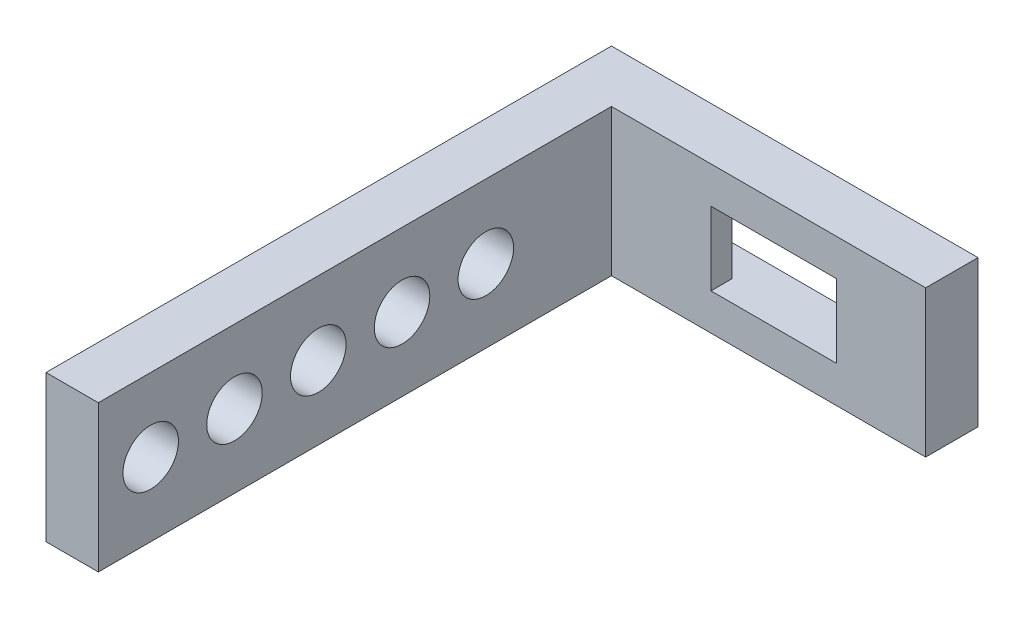
ISO-10303-21;
HEADER;
FILE_DESCRIPTION(('STEP AP214'),'2;1');
FILE_NAME('part.step','',(''),(''),'','','');
FILE_SCHEMA(('AUTOMOTIVE_DESIGN { 1 0 10303 214 1 1 1 1 }'));
ENDSEC;
DATA;
#1=APPLICATION_CONTEXT('core data for automotive mechanical design processes');
#2=APPLICATION_PROTOCOL_DEFINITION('international standard','automotive_design',2000,#1);
#3=PRODUCT_CONTEXT('',#1,'mechanical');
#4=PRODUCT('Part','Part','',(#3));
#5=PRODUCT_RELATED_PRODUCT_CATEGORY('part','',(#4));
#6=PRODUCT_DEFINITION_FORMATION('','',#4);
#7=PRODUCT_DEFINITION_CONTEXT('part definition',#1,'design');
#8=PRODUCT_DEFINITION('design','',#6,#7);
#9=PRODUCT_DEFINITION_SHAPE('','',#8);
#10=(LENGTH_UNIT() NAMED_UNIT(*) SI_UNIT(.MILLI.,.METRE.));
#11=(NAMED_UNIT(*) PLANE_ANGLE_UNIT() SI_UNIT($,.RADIAN.));
#12=(NAMED_UNIT(*) SI_UNIT($,.STERADIAN.) SOLID_ANGLE_UNIT());
#13=UNCERTAINTY_MEASURE_WITH_UNIT(LENGTH_MEASURE(1.E-05),#10,'distance_accuracy_value','');
#14=(GEOMETRIC_REPRESENTATION_CONTEXT(3) GLOBAL_UNCERTAINTY_ASSIGNED_CONTEXT((#13)) GLOBAL_UNIT_ASSIGNED_CONTEXT((#10,
#11,#12)) REPRESENTATION_CONTEXT('',''));
#15=CARTESIAN_POINT('',(0.,0.,0.));
#16=DIRECTION('',(0.,0.,1.));
#17=DIRECTION('',(1.,0.,0.));
#18=AXIS2_PLACEMENT_3D('',#15,#16,#17);
#19=CARTESIAN_POINT('',(0.,0.,-6.));
#20=DIRECTION('',(0.,0.,1.));
#21=DIRECTION('',(1.,0.,0.));
#22=AXIS2_PLACEMENT_3D('',#19,#20,#21);
#23=PLANE('',#22);
#24=DIRECTION('',(0.,-1.,0.));
#25=VECTOR('',#24,1.);
#26=CARTESIAN_POINT('',(26.5,10.5,-6.));
#27=LINE('',#26,#25);
#28=CARTESIAN_POINT('',(26.5,10.5,-6.));
#29=VERTEX_POINT('',#28);
#30=CARTESIAN_POINT('',(26.5,3.5,-6.));
#31=VERTEX_POINT('',#30);
#32=EDGE_CURVE('E308',#29,#31,#27,.T.);
#33=ORIENTED_EDGE('',*,*,#32,.F.);
#34=DIRECTION('',(1.,0.,0.));
#35=VECTOR('',#34,1.);
#36=CARTESIAN_POINT('',(8.,10.5,-6.));
#37=LINE('',#36,#35);
#38=CARTESIAN_POINT('',(33.,10.5,-6.));
#39=VERTEX_POINT('',#38);
#40=EDGE_CURVE('E287',#29,#39,#37,.T.);
#41=ORIENTED_EDGE('',*,*,#40,.T.);
#42=DIRECTION('',(0.,-1.,0.));
#43=VECTOR('',#42,1.);
#44=CARTESIAN_POINT('',(33.,10.5,-6.));
#45=LINE('',#44,#43);
#46=CARTESIAN_POINT('',(33.,3.5,-6.));
#47=VERTEX_POINT('',#46);
#48=EDGE_CURVE('E279',#39,#47,#45,.T.);
#49=ORIENTED_EDGE('',*,*,#48,.T.);
#50=DIRECTION('',(-1.,0.,0.));
#51=VECTOR('',#50,1.);
#52=CARTESIAN_POINT('',(8.,3.5,-6.));
#53=LINE('',#52,#51);
#54=EDGE_CURVE('E250',#47,#31,#53,.T.);
#55=ORIENTED_EDGE('',*,*,#54,.T.);
#56=EDGE_LOOP('',(#33,#41,#49,#55));
#57=FACE_BOUND('',#56,.T.);
#58=ADVANCED_FACE('F39',(#57),#23,.F.);
#59=DIRECTION('',(0.,1.,0.));
#60=VECTOR('',#59,1.);
#61=CARTESIAN_POINT('',(14.5,10.5,-6.));
#62=LINE('',#61,#60);
#63=CARTESIAN_POINT('',(14.5,3.5,-6.));
#64=VERTEX_POINT('',#63);
#65=CARTESIAN_POINT('',(14.5,10.5,-6.));
#66=VERTEX_POINT('',#65);
#67=EDGE_CURVE('E298',#64,#66,#62,.T.);
#68=ORIENTED_EDGE('',*,*,#67,.F.);
#69=CARTESIAN_POINT('',(8.,3.5,-6.));
#70=VERTEX_POINT('',#69);
#71=EDGE_CURVE('E278',#64,#70,#53,.T.);
#72=ORIENTED_EDGE('',*,*,#71,.T.);
#73=DIRECTION('',(0.,1.,0.));
#74=VECTOR('',#73,1.);
#75=CARTESIAN_POINT('',(8.,10.5,-6.));
#76=LINE('',#75,#74);
#77=CARTESIAN_POINT('',(8.,10.5,-6.));
#78=VERTEX_POINT('',#77);
#79=EDGE_CURVE('E262',#70,#78,#76,.T.);
#80=ORIENTED_EDGE('',*,*,#79,.T.);
#81=EDGE_CURVE('E283',#78,#66,#37,.T.);
#82=ORIENTED_EDGE('',*,*,#81,.T.);
#83=EDGE_LOOP('',(#68,#72,#80,#82));
#84=FACE_BOUND('',#83,.T.);
#85=ADVANCED_FACE('F331',(#84),#23,.F.);
#86=CARTESIAN_POINT('',(10.,14.,-4.));
#87=DIRECTION('',(0.,0.,-1.));
#88=DIRECTION('',(-1.,0.,0.));
#89=AXIS2_PLACEMENT_3D('',#86,#87,#88);
#90=PLANE('',#89);
#91=DIRECTION('',(-1.,0.,0.));
#92=VECTOR('',#91,1.);
#93=CARTESIAN_POINT('',(14.5,10.5,-4.));
#94=LINE('',#93,#92);
#95=CARTESIAN_POINT('',(26.5,10.5,-4.));
#96=VERTEX_POINT('',#95);
#97=CARTESIAN_POINT('',(14.5,10.5,-4.));
#98=VERTEX_POINT('',#97);
#99=EDGE_CURVE('E316',#96,#98,#94,.T.);
#100=ORIENTED_EDGE('',*,*,#99,.F.);
#101=DIRECTION('',(0.,1.,0.));
#102=VECTOR('',#101,1.);
#103=CARTESIAN_POINT('',(26.5,10.5,-4.));
#104=LINE('',#103,#102);
#105=CARTESIAN_POINT('',(26.5,3.5,-4.));
#106=VERTEX_POINT('',#105);
#107=EDGE_CURVE('E312',#106,#96,#104,.T.);
#108=ORIENTED_EDGE('',*,*,#107,.F.);
#109=DIRECTION('',(1.,0.,0.));
#110=VECTOR('',#109,1.);
#111=CARTESIAN_POINT('',(14.5,3.5,-4.));
#112=LINE('',#111,#110);
#113=CARTESIAN_POINT('',(14.5,3.5,-4.));
#114=VERTEX_POINT('',#113);
#115=EDGE_CURVE('E274',#114,#106,#112,.T.);
#116=ORIENTED_EDGE('',*,*,#115,.F.);
#117=DIRECTION('',(0.,-1.,0.));
#118=VECTOR('',#117,1.);
#119=CARTESIAN_POINT('',(14.5,10.5,-4.));
#120=LINE('',#119,#118);
#121=EDGE_CURVE('E320',#98,#114,#120,.T.);
#122=ORIENTED_EDGE('',*,*,#121,.F.);
#123=EDGE_LOOP('',(#100,#108,#116,#122));
#124=FACE_BOUND('',#123,.T.);
#125=DIRECTION('',(1.,0.,0.));
#126=VECTOR('',#125,1.);
#127=CARTESIAN_POINT('',(10.,0.,-4.));
#128=LINE('',#127,#126);
#129=CARTESIAN_POINT('',(5.,0.,-4.));
#130=VERTEX_POINT('',#129);
#131=CARTESIAN_POINT('',(35.,0.,-4.));
#132=VERTEX_POINT('',#131);
#133=EDGE_CURVE('E163',#130,#132,#128,.T.);
#134=ORIENTED_EDGE('',*,*,#133,.T.);
#135=DIRECTION('',(0.,-1.,0.));
#136=VECTOR('',#135,1.);
#137=CARTESIAN_POINT('',(35.,0.,-4.));
#138=LINE('',#137,#136);
#139=CARTESIAN_POINT('',(35.,14.,-3.99999999999998));
#140=VERTEX_POINT('',#139);
#141=EDGE_CURVE('E55',#140,#132,#138,.T.);
#142=ORIENTED_EDGE('',*,*,#141,.F.);
#143=DIRECTION('',(1.,0.,0.));
#144=VECTOR('',#143,1.);
#145=CARTESIAN_POINT('',(10.,14.,-4.));
#146=LINE('',#145,#144);
#147=CARTESIAN_POINT('',(5.,14.,-4.));
#148=VERTEX_POINT('',#147);
#149=EDGE_CURVE('E167',#148,#140,#146,.T.);
#150=ORIENTED_EDGE('',*,*,#149,.F.);
#151=DIRECTION('',(0.,1.,0.));
#152=VECTOR('',#151,1.);
#153=CARTESIAN_POINT('',(5.,0.,-4.));
#154=LINE('',#153,#152);
#155=EDGE_CURVE('E210',#130,#148,#154,.T.);
#156=ORIENTED_EDGE('',*,*,#155,.F.);
#157=EDGE_LOOP('',(#134,#142,#150,#156));
#158=FACE_BOUND('',#157,.T.);
#159=ADVANCED_FACE('F41',(#124,#158),#90,.F.);
#160=CARTESIAN_POINT('',(0.,14.,-9.));
#161=DIRECTION('',(0.,0.,1.));
#162=DIRECTION('',(1.,0.,0.));
#163=AXIS2_PLACEMENT_3D('',#160,#161,#162);
#164=PLANE('',#163);
#165=DIRECTION('',(1.,0.,0.));
#166=VECTOR('',#165,1.);
#167=CARTESIAN_POINT('',(8.,10.5,-9.));
#168=LINE('',#167,#166);
#169=CARTESIAN_POINT('',(8.,10.5,-9.));
#170=VERTEX_POINT('',#169);
#171=CARTESIAN_POINT('',(33.,10.5,-9.));
#172=VERTEX_POINT('',#171);
#173=EDGE_CURVE('E267',#170,#172,#168,.T.);
#174=ORIENTED_EDGE('',*,*,#173,.F.);
#175=DIRECTION('',(0.,1.,0.));
#176=VECTOR('',#175,1.);
#177=CARTESIAN_POINT('',(8.,10.5,-9.));
#178=LINE('',#177,#176);
#179=CARTESIAN_POINT('',(8.,3.5,-9.));
#180=VERTEX_POINT('',#179);
#181=EDGE_CURVE('E271',#180,#170,#178,.T.);
#182=ORIENTED_EDGE('',*,*,#181,.F.);
#183=DIRECTION('',(-1.,0.,0.));
#184=VECTOR('',#183,1.);
#185=CARTESIAN_POINT('',(8.,3.5,-9.));
#186=LINE('',#185,#184);
#187=CARTESIAN_POINT('',(33.,3.5,-9.));
#188=VERTEX_POINT('',#187);
#189=EDGE_CURVE('E258',#188,#180,#186,.T.);
#190=ORIENTED_EDGE('',*,*,#189,.F.);
#191=DIRECTION('',(0.,-1.,0.));
#192=VECTOR('',#191,1.);
#193=CARTESIAN_POINT('',(33.,10.5,-9.));
#194=LINE('',#193,#192);
#195=EDGE_CURVE('E263',#172,#188,#194,.T.);
#196=ORIENTED_EDGE('',*,*,#195,.F.);
#197=EDGE_LOOP('',(#174,#182,#190,#196));
#198=FACE_BOUND('',#197,.T.);
#199=DIRECTION('',(-1.,0.,0.));
#200=VECTOR('',#199,1.);
#201=CARTESIAN_POINT('',(11.5890955973018,14.,-9.));
#202=LINE('',#201,#200);
#203=CARTESIAN_POINT('',(35.,14.,-9.));
#204=VERTEX_POINT('',#203);
#205=CARTESIAN_POINT('',(0.,14.,-9.));
#206=VERTEX_POINT('',#205);
#207=EDGE_CURVE('E155',#204,#206,#202,.T.);
#208=ORIENTED_EDGE('',*,*,#207,.F.);
#209=DIRECTION('',(0.,1.,0.));
#210=VECTOR('',#209,1.);
#211=CARTESIAN_POINT('',(35.,0.,-9.));
#212=LINE('',#211,#210);
#213=CARTESIAN_POINT('',(35.,0.,-9.));
#214=VERTEX_POINT('',#213);
#215=EDGE_CURVE('E142',#214,#204,#212,.T.);
#216=ORIENTED_EDGE('',*,*,#215,.F.);
#217=DIRECTION('',(-1.,0.,0.));
#218=VECTOR('',#217,1.);
#219=CARTESIAN_POINT('',(0.,0.,-9.));
#220=LINE('',#219,#218);
#221=CARTESIAN_POINT('',(0.,0.,-9.));
#222=VERTEX_POINT('',#221);
#223=EDGE_CURVE('E154',#214,#222,#220,.T.);
#224=ORIENTED_EDGE('',*,*,#223,.T.);
#225=DIRECTION('',(0.,-1.,0.));
#226=VECTOR('',#225,1.);
#227=CARTESIAN_POINT('',(0.,14.,-9.));
#228=LINE('',#227,#226);
#229=EDGE_CURVE('E11',#206,#222,#228,.T.);
#230=ORIENTED_EDGE('',*,*,#229,.F.);
#231=EDGE_LOOP('',(#208,#216,#224,#230));
#232=FACE_BOUND('',#231,.T.);
#233=ADVANCED_FACE('F152',(#198,#232),#164,.F.);
#234=CARTESIAN_POINT('',(0.,14.,0.));
#235=DIRECTION('',(1.,0.,0.));
#236=DIRECTION('',(0.,0.,-1.));
#237=AXIS2_PLACEMENT_3D('',#234,#235,#236);
#238=PLANE('',#237);
#239=CARTESIAN_POINT('',(0.,6.99999999999999,8.00000000000001));
#240=DIRECTION('',(-1.,0.,0.));
#241=DIRECTION('',(0.,0.,1.));
#242=AXIS2_PLACEMENT_3D('',#239,#240,#241);
#243=CIRCLE('',#242,2.65);
#244=CARTESIAN_POINT('',(0.,6.99999999999999,10.65));
#245=VERTEX_POINT('',#244);
#246=EDGE_CURVE('E190',#245,#245,#243,.T.);
#247=ORIENTED_EDGE('',*,*,#246,.F.);
#248=EDGE_LOOP('',(#247));
#249=FACE_BOUND('',#248,.T.);
#250=CARTESIAN_POINT('',(0.,6.99999999999999,16.));
#251=DIRECTION('',(-1.,0.,0.));
#252=DIRECTION('',(0.,0.,1.));
#253=AXIS2_PLACEMENT_3D('',#250,#251,#252);
#254=CIRCLE('',#253,2.65);
#255=CARTESIAN_POINT('',(0.,6.99999999999999,18.65));
#256=VERTEX_POINT('',#255);
#257=EDGE_CURVE('E227',#256,#256,#254,.T.);
#258=ORIENTED_EDGE('',*,*,#257,.F.);
#259=EDGE_LOOP('',(#258));
#260=FACE_BOUND('',#259,.T.);
#261=CARTESIAN_POINT('',(0.,6.99999999999999,24.));
#262=DIRECTION('',(-1.,0.,0.));
#263=DIRECTION('',(0.,0.,1.));
#264=AXIS2_PLACEMENT_3D('',#261,#262,#263);
#265=CIRCLE('',#264,2.65);
#266=CARTESIAN_POINT('',(0.,6.99999999999999,26.65));
#267=VERTEX_POINT('',#266);
#268=EDGE_CURVE('E219',#267,#267,#265,.T.);
#269=ORIENTED_EDGE('',*,*,#268,.F.);
#270=EDGE_LOOP('',(#269));
#271=FACE_BOUND('',#270,.T.);
#272=CARTESIAN_POINT('',(0.,6.99999999999999,32.));
#273=DIRECTION('',(-1.,0.,0.));
#274=DIRECTION('',(0.,0.,1.));
#275=AXIS2_PLACEMENT_3D('',#272,#273,#274);
#276=CIRCLE('',#275,2.65);
#277=CARTESIAN_POINT('',(0.,6.99999999999999,34.65));
#278=VERTEX_POINT('',#277);
#279=EDGE_CURVE('E211',#278,#278,#276,.T.);
#280=ORIENTED_EDGE('',*,*,#279,.F.);
#281=EDGE_LOOP('',(#280));
#282=FACE_BOUND('',#281,.T.);
#283=CARTESIAN_POINT('',(0.,6.99999999999999,40.));
#284=DIRECTION('',(-1.,0.,0.));
#285=DIRECTION('',(0.,0.,1.));
#286=AXIS2_PLACEMENT_3D('',#283,#284,#285);
#287=CIRCLE('',#286,2.65);
#288=CARTESIAN_POINT('',(0.,6.99999999999999,42.65));
#289=VERTEX_POINT('',#288);
#290=EDGE_CURVE('E201',#289,#289,#287,.T.);
#291=ORIENTED_EDGE('',*,*,#290,.F.);
#292=EDGE_LOOP('',(#291));
#293=FACE_BOUND('',#292,.T.);
#294=DIRECTION('',(0.,0.,1.));
#295=VECTOR('',#294,1.);
#296=CARTESIAN_POINT('',(0.,0.,0.));
#297=LINE('',#296,#295);
#298=CARTESIAN_POINT('',(0.,0.,45.));
#299=VERTEX_POINT('',#298);
#300=EDGE_CURVE('E161',#222,#299,#297,.T.);
#301=ORIENTED_EDGE('',*,*,#300,.T.);
#302=DIRECTION('',(0.,1.,0.));
#303=VECTOR('',#302,1.);
#304=CARTESIAN_POINT('',(0.,0.,45.));
#305=LINE('',#304,#303);
#306=CARTESIAN_POINT('',(0.,14.,45.));
#307=VERTEX_POINT('',#306);
#308=EDGE_CURVE('E185',#299,#307,#305,.T.);
#309=ORIENTED_EDGE('',*,*,#308,.T.);
#310=DIRECTION('',(0.,0.,1.));
#311=VECTOR('',#310,1.);
#312=CARTESIAN_POINT('',(0.,14.,0.));
#313=LINE('',#312,#311);
#314=EDGE_CURVE('E48',#206,#307,#313,.T.);
#315=ORIENTED_EDGE('',*,*,#314,.F.);
#316=ORIENTED_EDGE('',*,*,#229,.T.);
#317=EDGE_LOOP('',(#301,#309,#315,#316));
#318=FACE_BOUND('',#317,.T.);
#319=ADVANCED_FACE('F405',(#249,#260,#271,#282,#293,#318),#238,.F.);
#320=CARTESIAN_POINT('',(0.,14.,0.));
#321=DIRECTION('',(0.,-1.,0.));
#322=DIRECTION('',(0.,0.,-1.));
#323=AXIS2_PLACEMENT_3D('',#320,#321,#322);
#324=PLANE('',#323);
#325=ORIENTED_EDGE('',*,*,#149,.T.);
#326=DIRECTION('',(0.,0.,-1.));
#327=VECTOR('',#326,1.);
#328=CARTESIAN_POINT('',(35.,14.,45.001));
#329=LINE('',#328,#327);
#330=EDGE_CURVE('E148',#140,#204,#329,.T.);
#331=ORIENTED_EDGE('',*,*,#330,.T.);
#332=ORIENTED_EDGE('',*,*,#207,.T.);
#333=ORIENTED_EDGE('',*,*,#314,.T.);
#334=DIRECTION('',(-1.,0.,0.));
#335=VECTOR('',#334,1.);
#336=CARTESIAN_POINT('',(5.,14.,45.));
#337=LINE('',#336,#335);
#338=CARTESIAN_POINT('',(5.,14.,45.));
#339=VERTEX_POINT('',#338);
#340=EDGE_CURVE('E168',#339,#307,#337,.T.);
#341=ORIENTED_EDGE('',*,*,#340,.F.);
#342=DIRECTION('',(0.,0.,-1.));
#343=VECTOR('',#342,1.);
#344=CARTESIAN_POINT('',(5.,14.,0.));
#345=LINE('',#344,#343);
#346=EDGE_CURVE('E181',#339,#148,#345,.T.);
#347=ORIENTED_EDGE('',*,*,#346,.T.);
#348=EDGE_LOOP('',(#325,#331,#332,#333,#341,#347));
#349=FACE_BOUND('',#348,.T.);
#350=ADVANCED_FACE('F402',(#349),#324,.F.);
#351=CARTESIAN_POINT('',(0.,0.,0.));
#352=DIRECTION('',(0.,-1.,0.));
#353=DIRECTION('',(0.,0.,-1.));
#354=AXIS2_PLACEMENT_3D('',#351,#352,#353);
#355=PLANE('',#354);
#356=DIRECTION('',(0.,0.,-1.));
#357=VECTOR('',#356,1.);
#358=CARTESIAN_POINT('',(35.,0.,45.001));
#359=LINE('',#358,#357);
#360=EDGE_CURVE('E139',#132,#214,#359,.T.);
#361=ORIENTED_EDGE('',*,*,#360,.F.);
#362=ORIENTED_EDGE('',*,*,#133,.F.);
#363=DIRECTION('',(0.,0.,1.));
#364=VECTOR('',#363,1.);
#365=CARTESIAN_POINT('',(5.,0.,0.));
#366=LINE('',#365,#364);
#367=CARTESIAN_POINT('',(5.,0.,45.));
#368=VERTEX_POINT('',#367);
#369=EDGE_CURVE('E189',#130,#368,#366,.T.);
#370=ORIENTED_EDGE('',*,*,#369,.T.);
#371=DIRECTION('',(-1.,0.,0.));
#372=VECTOR('',#371,1.);
#373=CARTESIAN_POINT('',(5.,0.,45.));
#374=LINE('',#373,#372);
#375=EDGE_CURVE('E178',#368,#299,#374,.T.);
#376=ORIENTED_EDGE('',*,*,#375,.T.);
#377=ORIENTED_EDGE('',*,*,#300,.F.);
#378=ORIENTED_EDGE('',*,*,#223,.F.);
#379=EDGE_LOOP('',(#361,#362,#370,#376,#377,#378));
#380=FACE_BOUND('',#379,.T.);
#381=ADVANCED_FACE('F159',(#380),#355,.T.);
#382=CARTESIAN_POINT('',(5.,0.,45.));
#383=DIRECTION('',(0.,0.,1.));
#384=DIRECTION('',(1.,0.,0.));
#385=AXIS2_PLACEMENT_3D('',#382,#383,#384);
#386=PLANE('',#385);
#387=ORIENTED_EDGE('',*,*,#308,.F.);
#388=ORIENTED_EDGE('',*,*,#375,.F.);
#389=DIRECTION('',(0.,1.,0.));
#390=VECTOR('',#389,1.);
#391=CARTESIAN_POINT('',(5.,0.,45.));
#392=LINE('',#391,#390);
#393=EDGE_CURVE('E194',#368,#339,#392,.T.);
#394=ORIENTED_EDGE('',*,*,#393,.T.);
#395=ORIENTED_EDGE('',*,*,#340,.T.);
#396=EDGE_LOOP('',(#387,#388,#394,#395));
#397=FACE_BOUND('',#396,.T.);
#398=ADVANCED_FACE('F397',(#397),#386,.T.);
#399=CARTESIAN_POINT('',(5.,0.,0.));
#400=DIRECTION('',(1.,0.,0.));
#401=DIRECTION('',(0.,0.,-1.));
#402=AXIS2_PLACEMENT_3D('',#399,#400,#401);
#403=PLANE('',#402);
#404=ORIENTED_EDGE('',*,*,#155,.T.);
#405=ORIENTED_EDGE('',*,*,#346,.F.);
#406=ORIENTED_EDGE('',*,*,#393,.F.);
#407=ORIENTED_EDGE('',*,*,#369,.F.);
#408=EDGE_LOOP('',(#404,#405,#406,#407));
#409=FACE_BOUND('',#408,.T.);
#410=CARTESIAN_POINT('',(5.,6.99999999999999,8.00000000000001));
#411=DIRECTION('',(1.,0.,0.));
#412=DIRECTION('',(0.,0.,-1.));
#413=AXIS2_PLACEMENT_3D('',#410,#411,#412);
#414=CIRCLE('',#413,2.65);
#415=CARTESIAN_POINT('',(5.,6.99999999999999,5.35000000000001));
#416=VERTEX_POINT('',#415);
#417=EDGE_CURVE('E231',#416,#416,#414,.F.);
#418=ORIENTED_EDGE('',*,*,#417,.T.);
#419=EDGE_LOOP('',(#418));
#420=FACE_BOUND('',#419,.T.);
#421=CARTESIAN_POINT('',(5.,6.99999999999999,16.));
#422=DIRECTION('',(1.,0.,0.));
#423=DIRECTION('',(0.,0.,-1.));
#424=AXIS2_PLACEMENT_3D('',#421,#422,#423);
#425=CIRCLE('',#424,2.65);
#426=CARTESIAN_POINT('',(5.,6.99999999999999,13.35));
#427=VERTEX_POINT('',#426);
#428=EDGE_CURVE('E223',#427,#427,#425,.F.);
#429=ORIENTED_EDGE('',*,*,#428,.T.);
#430=EDGE_LOOP('',(#429));
#431=FACE_BOUND('',#430,.T.);
#432=CARTESIAN_POINT('',(5.,6.99999999999999,24.));
#433=DIRECTION('',(1.,0.,0.));
#434=DIRECTION('',(0.,0.,-1.));
#435=AXIS2_PLACEMENT_3D('',#432,#433,#434);
#436=CIRCLE('',#435,2.65);
#437=CARTESIAN_POINT('',(5.,6.99999999999999,21.35));
#438=VERTEX_POINT('',#437);
#439=EDGE_CURVE('E215',#438,#438,#436,.F.);
#440=ORIENTED_EDGE('',*,*,#439,.T.);
#441=EDGE_LOOP('',(#440));
#442=FACE_BOUND('',#441,.T.);
#443=CARTESIAN_POINT('',(5.,6.99999999999999,32.));
#444=DIRECTION('',(1.,0.,0.));
#445=DIRECTION('',(0.,0.,-1.));
#446=AXIS2_PLACEMENT_3D('',#443,#444,#445);
#447=CIRCLE('',#446,2.65);
#448=CARTESIAN_POINT('',(5.,6.99999999999999,29.35));
#449=VERTEX_POINT('',#448);
#450=EDGE_CURVE('E205',#449,#449,#447,.F.);
#451=ORIENTED_EDGE('',*,*,#450,.T.);
#452=EDGE_LOOP('',(#451));
#453=FACE_BOUND('',#452,.T.);
#454=CARTESIAN_POINT('',(5.,6.99999999999999,40.));
#455=DIRECTION('',(1.,0.,0.));
#456=DIRECTION('',(0.,0.,-1.));
#457=AXIS2_PLACEMENT_3D('',#454,#455,#456);
#458=CIRCLE('',#457,2.65);
#459=CARTESIAN_POINT('',(5.,6.99999999999999,37.35));
#460=VERTEX_POINT('',#459);
#461=EDGE_CURVE('E206',#460,#460,#458,.F.);
#462=ORIENTED_EDGE('',*,*,#461,.T.);
#463=EDGE_LOOP('',(#462));
#464=FACE_BOUND('',#463,.T.);
#465=ADVANCED_FACE('F393',(#409,#420,#431,#442,#453,#464),#403,.T.);
#466=CARTESIAN_POINT('',(12.4953318805774,6.99999999999999,40.));
#467=DIRECTION('',(-1.,0.,0.));
#468=DIRECTION('',(0.,0.,1.));
#469=AXIS2_PLACEMENT_3D('',#466,#467,#468);
#470=CYLINDRICAL_SURFACE('',#469,2.65);
#471=ORIENTED_EDGE('',*,*,#290,.T.);
#472=EDGE_LOOP('',(#471));
#473=FACE_BOUND('',#472,.T.);
#474=ORIENTED_EDGE('',*,*,#461,.F.);
#475=EDGE_LOOP('',(#474));
#476=FACE_BOUND('',#475,.T.);
#477=ADVANCED_FACE('F389',(#473,#476),#470,.F.);
#478=CARTESIAN_POINT('',(12.4953318805774,6.99999999999999,32.));
#479=DIRECTION('',(-1.,0.,0.));
#480=DIRECTION('',(0.,0.,1.));
#481=AXIS2_PLACEMENT_3D('',#478,#479,#480);
#482=CYLINDRICAL_SURFACE('',#481,2.65);
#483=ORIENTED_EDGE('',*,*,#279,.T.);
#484=EDGE_LOOP('',(#483));
#485=FACE_BOUND('',#484,.T.);
#486=ORIENTED_EDGE('',*,*,#450,.F.);
#487=EDGE_LOOP('',(#486));
#488=FACE_BOUND('',#487,.T.);
#489=ADVANCED_FACE('F385',(#485,#488),#482,.F.);
#490=CARTESIAN_POINT('',(12.4953318805774,6.99999999999999,24.));
#491=DIRECTION('',(-1.,0.,0.));
#492=DIRECTION('',(0.,0.,1.));
#493=AXIS2_PLACEMENT_3D('',#490,#491,#492);
#494=CYLINDRICAL_SURFACE('',#493,2.65);
#495=ORIENTED_EDGE('',*,*,#268,.T.);
#496=EDGE_LOOP('',(#495));
#497=FACE_BOUND('',#496,.T.);
#498=ORIENTED_EDGE('',*,*,#439,.F.);
#499=EDGE_LOOP('',(#498));
#500=FACE_BOUND('',#499,.T.);
#501=ADVANCED_FACE('F381',(#497,#500),#494,.F.);
#502=CARTESIAN_POINT('',(12.4953318805774,6.99999999999999,16.));
#503=DIRECTION('',(-1.,0.,0.));
#504=DIRECTION('',(0.,0.,1.));
#505=AXIS2_PLACEMENT_3D('',#502,#503,#504);
#506=CYLINDRICAL_SURFACE('',#505,2.65);
#507=ORIENTED_EDGE('',*,*,#257,.T.);
#508=EDGE_LOOP('',(#507));
#509=FACE_BOUND('',#508,.T.);
#510=ORIENTED_EDGE('',*,*,#428,.F.);
#511=EDGE_LOOP('',(#510));
#512=FACE_BOUND('',#511,.T.);
#513=ADVANCED_FACE('F377',(#509,#512),#506,.F.);
#514=CARTESIAN_POINT('',(12.4953318805774,6.99999999999999,8.00000000000001));
#515=DIRECTION('',(-1.,0.,0.));
#516=DIRECTION('',(0.,0.,1.));
#517=AXIS2_PLACEMENT_3D('',#514,#515,#516);
#518=CYLINDRICAL_SURFACE('',#517,2.65);
#519=ORIENTED_EDGE('',*,*,#246,.T.);
#520=EDGE_LOOP('',(#519));
#521=FACE_BOUND('',#520,.T.);
#522=ORIENTED_EDGE('',*,*,#417,.F.);
#523=EDGE_LOOP('',(#522));
#524=FACE_BOUND('',#523,.T.);
#525=ADVANCED_FACE('F374',(#521,#524),#518,.F.);
#526=CARTESIAN_POINT('',(8.,10.5,-6.));
#527=DIRECTION('',(-1.,0.,0.));
#528=DIRECTION('',(0.,0.,1.));
#529=AXIS2_PLACEMENT_3D('',#526,#527,#528);
#530=PLANE('',#529);
#531=ORIENTED_EDGE('',*,*,#181,.T.);
#532=DIRECTION('',(0.,0.,-1.));
#533=VECTOR('',#532,1.);
#534=CARTESIAN_POINT('',(8.,10.5,-6.));
#535=LINE('',#534,#533);
#536=EDGE_CURVE('E245',#78,#170,#535,.T.);
#537=ORIENTED_EDGE('',*,*,#536,.F.);
#538=ORIENTED_EDGE('',*,*,#79,.F.);
#539=DIRECTION('',(0.,0.,-1.));
#540=VECTOR('',#539,1.);
#541=CARTESIAN_POINT('',(8.,3.5,-6.));
#542=LINE('',#541,#540);
#543=EDGE_CURVE('E244',#70,#180,#542,.T.);
#544=ORIENTED_EDGE('',*,*,#543,.T.);
#545=EDGE_LOOP('',(#531,#537,#538,#544));
#546=FACE_BOUND('',#545,.T.);
#547=ADVANCED_FACE('F338',(#546),#530,.F.);
#548=CARTESIAN_POINT('',(8.,3.5,-6.));
#549=DIRECTION('',(0.,-1.,0.));
#550=DIRECTION('',(1.,0.,0.));
#551=AXIS2_PLACEMENT_3D('',#548,#549,#550);
#552=PLANE('',#551);
#553=ORIENTED_EDGE('',*,*,#189,.T.);
#554=ORIENTED_EDGE('',*,*,#543,.F.);
#555=ORIENTED_EDGE('',*,*,#71,.F.);
#556=DIRECTION('',(0.,0.,-1.));
#557=VECTOR('',#556,1.);
#558=CARTESIAN_POINT('',(14.5,3.5,45.001));
#559=LINE('',#558,#557);
#560=EDGE_CURVE('E63',#114,#64,#559,.T.);
#561=ORIENTED_EDGE('',*,*,#560,.F.);
#562=ORIENTED_EDGE('',*,*,#115,.T.);
#563=DIRECTION('',(0.,0.,-1.));
#564=VECTOR('',#563,1.);
#565=CARTESIAN_POINT('',(26.5,3.5,45.001));
#566=LINE('',#565,#564);
#567=EDGE_CURVE('E295',#106,#31,#566,.T.);
#568=ORIENTED_EDGE('',*,*,#567,.T.);
#569=ORIENTED_EDGE('',*,*,#54,.F.);
#570=DIRECTION('',(0.,0.,-1.));
#571=VECTOR('',#570,1.);
#572=CARTESIAN_POINT('',(33.,3.5,-6.));
#573=LINE('',#572,#571);
#574=EDGE_CURVE('E253',#47,#188,#573,.T.);
#575=ORIENTED_EDGE('',*,*,#574,.T.);
#576=EDGE_LOOP('',(#553,#554,#555,#561,#562,#568,#569,#575));
#577=FACE_BOUND('',#576,.T.);
#578=ADVANCED_FACE('F334',(#577),#552,.F.);
#579=CARTESIAN_POINT('',(33.,10.5,-6.));
#580=DIRECTION('',(1.,0.,0.));
#581=DIRECTION('',(0.,0.,-1.));
#582=AXIS2_PLACEMENT_3D('',#579,#580,#581);
#583=PLANE('',#582);
#584=ORIENTED_EDGE('',*,*,#195,.T.);
#585=ORIENTED_EDGE('',*,*,#574,.F.);
#586=ORIENTED_EDGE('',*,*,#48,.F.);
#587=DIRECTION('',(0.,0.,-1.));
#588=VECTOR('',#587,1.);
#589=CARTESIAN_POINT('',(33.,10.5,-6.));
#590=LINE('',#589,#588);
#591=EDGE_CURVE('E249',#39,#172,#590,.T.);
#592=ORIENTED_EDGE('',*,*,#591,.T.);
#593=EDGE_LOOP('',(#584,#585,#586,#592));
#594=FACE_BOUND('',#593,.T.);
#595=ADVANCED_FACE('F366',(#594),#583,.F.);
#596=CARTESIAN_POINT('',(8.,10.5,-6.));
#597=DIRECTION('',(0.,1.,0.));
#598=DIRECTION('',(-1.,0.,0.));
#599=AXIS2_PLACEMENT_3D('',#596,#597,#598);
#600=PLANE('',#599);
#601=ORIENTED_EDGE('',*,*,#173,.T.);
#602=ORIENTED_EDGE('',*,*,#591,.F.);
#603=ORIENTED_EDGE('',*,*,#40,.F.);
#604=DIRECTION('',(0.,0.,-1.));
#605=VECTOR('',#604,1.);
#606=CARTESIAN_POINT('',(26.5,10.5,45.001));
#607=LINE('',#606,#605);
#608=EDGE_CURVE('E294',#96,#29,#607,.T.);
#609=ORIENTED_EDGE('',*,*,#608,.F.);
#610=ORIENTED_EDGE('',*,*,#99,.T.);
#611=DIRECTION('',(0.,0.,-1.));
#612=VECTOR('',#611,1.);
#613=CARTESIAN_POINT('',(14.5,10.5,45.001));
#614=LINE('',#613,#612);
#615=EDGE_CURVE('E301',#98,#66,#614,.T.);
#616=ORIENTED_EDGE('',*,*,#615,.T.);
#617=ORIENTED_EDGE('',*,*,#81,.F.);
#618=ORIENTED_EDGE('',*,*,#536,.T.);
#619=EDGE_LOOP('',(#601,#602,#603,#609,#610,#616,#617,#618));
#620=FACE_BOUND('',#619,.T.);
#621=ADVANCED_FACE('F342',(#620),#600,.F.);
#622=CARTESIAN_POINT('',(26.5,10.5,45.001));
#623=DIRECTION('',(1.,0.,0.));
#624=DIRECTION('',(0.,0.,-1.));
#625=AXIS2_PLACEMENT_3D('',#622,#623,#624);
#626=PLANE('',#625);
#627=ORIENTED_EDGE('',*,*,#107,.T.);
#628=ORIENTED_EDGE('',*,*,#608,.T.);
#629=ORIENTED_EDGE('',*,*,#32,.T.);
#630=ORIENTED_EDGE('',*,*,#567,.F.);
#631=EDGE_LOOP('',(#627,#628,#629,#630));
#632=FACE_BOUND('',#631,.T.);
#633=ADVANCED_FACE('F347',(#632),#626,.F.);
#634=CARTESIAN_POINT('',(14.5,10.5,45.001));
#635=DIRECTION('',(-1.,0.,0.));
#636=DIRECTION('',(0.,0.,1.));
#637=AXIS2_PLACEMENT_3D('',#634,#635,#636);
#638=PLANE('',#637);
#639=ORIENTED_EDGE('',*,*,#121,.T.);
#640=ORIENTED_EDGE('',*,*,#560,.T.);
#641=ORIENTED_EDGE('',*,*,#67,.T.);
#642=ORIENTED_EDGE('',*,*,#615,.F.);
#643=EDGE_LOOP('',(#639,#640,#641,#642));
#644=FACE_BOUND('',#643,.T.);
#645=ADVANCED_FACE('F345',(#644),#638,.F.);
#646=CARTESIAN_POINT('',(35.,0.,45.001));
#647=DIRECTION('',(-1.,0.,0.));
#648=DIRECTION('',(0.,0.,1.));
#649=AXIS2_PLACEMENT_3D('',#646,#647,#648);
#650=PLANE('',#649);
#651=ORIENTED_EDGE('',*,*,#141,.T.);
#652=ORIENTED_EDGE('',*,*,#360,.T.);
#653=ORIENTED_EDGE('',*,*,#215,.T.);
#654=ORIENTED_EDGE('',*,*,#330,.F.);
#655=EDGE_LOOP('',(#651,#652,#653,#654));
#656=FACE_BOUND('',#655,.T.);
#657=ADVANCED_FACE('F141',(#656),#650,.F.);
#658=CLOSED_SHELL('',(#58,#85,#159,#233,#319,#350,#381,#398,#465,#477,#489,#501,#513,#525,#547,
#578,#595,#621,#633,#645,#657));
#659=MANIFOLD_SOLID_BREP('B2',#658);
#660=ADVANCED_BREP_SHAPE_REPRESENTATION('',(#18,#659),#14);
#661=SHAPE_DEFINITION_REPRESENTATION(#9,#660);
ENDSEC;
END-ISO-10303-21;
